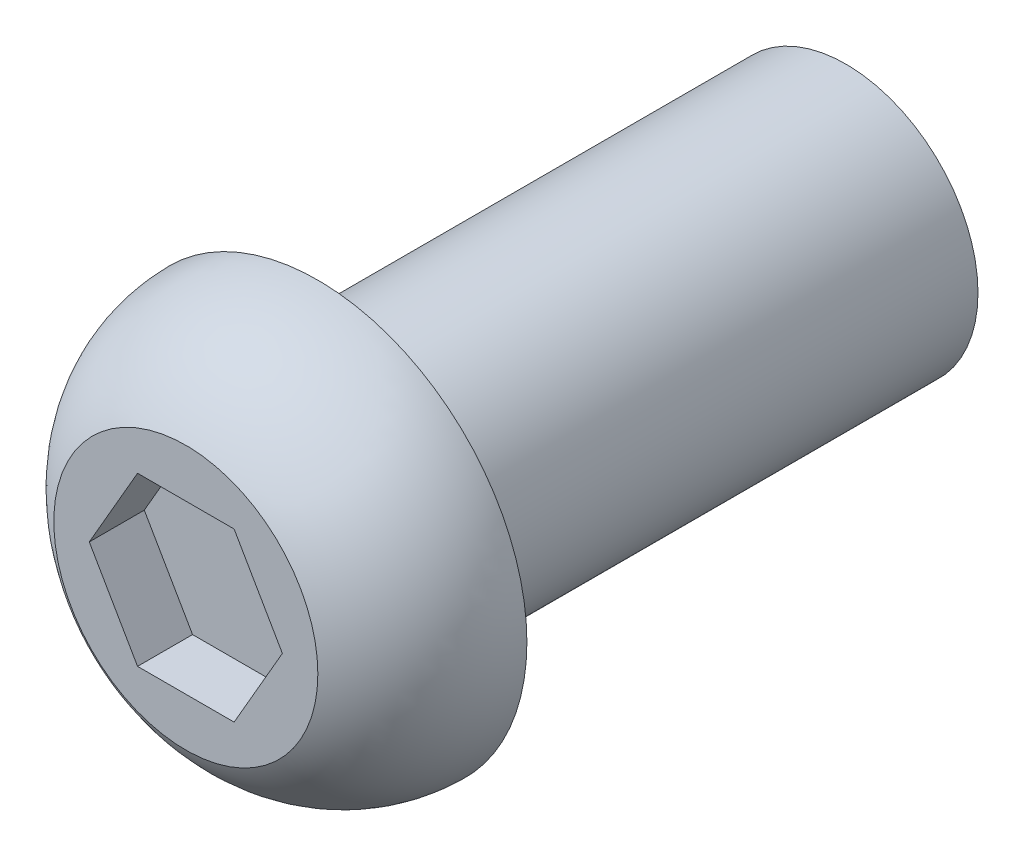
ISO-10303-21;
HEADER;
FILE_DESCRIPTION(('STEP AP214'),'2;1');
FILE_NAME('part.step','',(''),(''),'','','');
FILE_SCHEMA(('AUTOMOTIVE_DESIGN { 1 0 10303 214 1 1 1 1 }'));
ENDSEC;
DATA;
#1=APPLICATION_CONTEXT('core data for automotive mechanical design processes');
#2=APPLICATION_PROTOCOL_DEFINITION('international standard','automotive_design',2000,#1);
#3=PRODUCT_CONTEXT('',#1,'mechanical');
#4=PRODUCT('Part','Part','',(#3));
#5=PRODUCT_RELATED_PRODUCT_CATEGORY('part','',(#4));
#6=PRODUCT_DEFINITION_FORMATION('','',#4);
#7=PRODUCT_DEFINITION_CONTEXT('part definition',#1,'design');
#8=PRODUCT_DEFINITION('design','',#6,#7);
#9=PRODUCT_DEFINITION_SHAPE('','',#8);
#10=(LENGTH_UNIT() NAMED_UNIT(*) SI_UNIT(.MILLI.,.METRE.));
#11=(NAMED_UNIT(*) PLANE_ANGLE_UNIT() SI_UNIT($,.RADIAN.));
#12=(NAMED_UNIT(*) SI_UNIT($,.STERADIAN.) SOLID_ANGLE_UNIT());
#13=UNCERTAINTY_MEASURE_WITH_UNIT(LENGTH_MEASURE(1.E-05),#10,'distance_accuracy_value','');
#14=(GEOMETRIC_REPRESENTATION_CONTEXT(3) GLOBAL_UNCERTAINTY_ASSIGNED_CONTEXT((#13)) GLOBAL_UNIT_ASSIGNED_CONTEXT((#10,
#11,#12)) REPRESENTATION_CONTEXT('',''));
#15=CARTESIAN_POINT('',(0.,0.,0.));
#16=DIRECTION('',(0.,0.,1.));
#17=DIRECTION('',(1.,0.,0.));
#18=AXIS2_PLACEMENT_3D('',#15,#16,#17);
#19=CARTESIAN_POINT('',(0.,-6.,-6.));
#20=DIRECTION('',(0.,0.,1.));
#21=DIRECTION('',(1.,0.,0.));
#22=AXIS2_PLACEMENT_3D('',#19,#20,#21);
#23=PLANE('',#22);
#24=CARTESIAN_POINT('',(0.,0.,-6.));
#25=DIRECTION('',(0.,0.,1.));
#26=DIRECTION('',(1.,0.,0.));
#27=AXIS2_PLACEMENT_3D('',#24,#25,#26);
#28=CIRCLE('',#27,9.5);
#29=CARTESIAN_POINT('',(9.5,0.,-6.));
#30=VERTEX_POINT('',#29);
#31=EDGE_CURVE('E123',#30,#30,#28,.T.);
#32=ORIENTED_EDGE('',*,*,#31,.F.);
#33=EDGE_LOOP('',(#32));
#34=FACE_BOUND('',#33,.T.);
#35=CARTESIAN_POINT('',(0.,0.,-6.));
#36=DIRECTION('',(0.,0.,1.));
#37=DIRECTION('',(1.,0.,0.));
#38=AXIS2_PLACEMENT_3D('',#35,#36,#37);
#39=CIRCLE('',#38,6.);
#40=CARTESIAN_POINT('',(6.,0.,-6.));
#41=VERTEX_POINT('',#40);
#42=EDGE_CURVE('E41',#41,#41,#39,.T.);
#43=ORIENTED_EDGE('',*,*,#42,.T.);
#44=EDGE_LOOP('',(#43));
#45=FACE_BOUND('',#44,.T.);
#46=ADVANCED_FACE('F34',(#34,#45),#23,.F.);
#47=CARTESIAN_POINT('',(0.,0.,-30.));
#48=DIRECTION('',(0.,0.,1.));
#49=DIRECTION('',(1.,0.,0.));
#50=AXIS2_PLACEMENT_3D('',#47,#48,#49);
#51=PLANE('',#50);
#52=CARTESIAN_POINT('',(0.,0.,-30.));
#53=DIRECTION('',(0.,0.,1.));
#54=DIRECTION('',(1.,0.,0.));
#55=AXIS2_PLACEMENT_3D('',#52,#53,#54);
#56=CIRCLE('',#55,6.);
#57=CARTESIAN_POINT('',(6.,0.,-30.));
#58=VERTEX_POINT('',#57);
#59=EDGE_CURVE('E11',#58,#58,#56,.T.);
#60=ORIENTED_EDGE('',*,*,#59,.F.);
#61=EDGE_LOOP('',(#60));
#62=FACE_BOUND('',#61,.T.);
#63=ADVANCED_FACE('F148',(#62),#51,.F.);
#64=CARTESIAN_POINT('',(0.,0.,0.));
#65=DIRECTION('',(0.,0.,1.));
#66=DIRECTION('',(1.,0.,0.));
#67=AXIS2_PLACEMENT_3D('',#64,#65,#66);
#68=CYLINDRICAL_SURFACE('',#67,6.);
#69=ORIENTED_EDGE('',*,*,#42,.F.);
#70=EDGE_LOOP('',(#69));
#71=FACE_BOUND('',#70,.T.);
#72=ORIENTED_EDGE('',*,*,#59,.T.);
#73=EDGE_LOOP('',(#72));
#74=FACE_BOUND('',#73,.T.);
#75=ADVANCED_FACE('F144',(#71,#74),#68,.T.);
#76=CARTESIAN_POINT('',(0.,0.,-6.));
#77=DIRECTION('',(0.,0.,1.));
#78=DIRECTION('',(1.,0.,0.));
#79=AXIS2_PLACEMENT_3D('',#76,#77,#78);
#80=DEGENERATE_TOROIDAL_SURFACE('',#79,2.60714285714286,6.89285714285714,.T.);
#81=ORIENTED_EDGE('',*,*,#31,.T.);
#82=EDGE_LOOP('',(#81));
#83=FACE_BOUND('',#82,.T.);
#84=CARTESIAN_POINT('',(0.,0.,0.));
#85=DIRECTION('',(0.,0.,1.));
#86=DIRECTION('',(1.,0.,0.));
#87=AXIS2_PLACEMENT_3D('',#84,#85,#86);
#88=CIRCLE('',#87,6.);
#89=CARTESIAN_POINT('',(6.,0.,0.));
#90=VERTEX_POINT('',#89);
#91=EDGE_CURVE('E174',#90,#90,#88,.T.);
#92=ORIENTED_EDGE('',*,*,#91,.F.);
#93=EDGE_LOOP('',(#92));
#94=FACE_BOUND('',#93,.T.);
#95=ADVANCED_FACE('F147',(#83,#94),#80,.T.);
#96=CARTESIAN_POINT('',(2.19393102292058,-3.8,-2.5));
#97=DIRECTION('',(0.,0.,1.));
#98=DIRECTION('',(1.,0.,0.));
#99=AXIS2_PLACEMENT_3D('',#96,#97,#98);
#100=PLANE('',#99);
#101=DIRECTION('',(1.,0.,0.));
#102=VECTOR('',#101,1.);
#103=CARTESIAN_POINT('',(-2.19393102292058,-3.8,-2.5));
#104=LINE('',#103,#102);
#105=CARTESIAN_POINT('',(-2.19393102292058,-3.8,-2.5));
#106=VERTEX_POINT('',#105);
#107=CARTESIAN_POINT('',(2.19393102292058,-3.8,-2.5));
#108=VERTEX_POINT('',#107);
#109=EDGE_CURVE('E134',#106,#108,#104,.T.);
#110=ORIENTED_EDGE('',*,*,#109,.T.);
#111=DIRECTION('',(0.5,0.866025403784439,0.));
#112=VECTOR('',#111,1.);
#113=CARTESIAN_POINT('',(2.19393102292058,-3.8,-2.5));
#114=LINE('',#113,#112);
#115=CARTESIAN_POINT('',(4.38786204584116,0.,-2.5));
#116=VERTEX_POINT('',#115);
#117=EDGE_CURVE('E116',#108,#116,#114,.T.);
#118=ORIENTED_EDGE('',*,*,#117,.T.);
#119=DIRECTION('',(-0.5,0.866025403784439,0.));
#120=VECTOR('',#119,1.);
#121=CARTESIAN_POINT('',(4.38786204584116,0.,-2.5));
#122=LINE('',#121,#120);
#123=CARTESIAN_POINT('',(2.19393102292058,3.8,-2.5));
#124=VERTEX_POINT('',#123);
#125=EDGE_CURVE('E114',#116,#124,#122,.T.);
#126=ORIENTED_EDGE('',*,*,#125,.T.);
#127=DIRECTION('',(-1.,0.,0.));
#128=VECTOR('',#127,1.);
#129=CARTESIAN_POINT('',(2.19393102292058,3.8,-2.5));
#130=LINE('',#129,#128);
#131=CARTESIAN_POINT('',(-2.19393102292058,3.8,-2.5));
#132=VERTEX_POINT('',#131);
#133=EDGE_CURVE('E93',#124,#132,#130,.T.);
#134=ORIENTED_EDGE('',*,*,#133,.T.);
#135=DIRECTION('',(-0.5,-0.866025403784439,0.));
#136=VECTOR('',#135,1.);
#137=CARTESIAN_POINT('',(-2.19393102292058,3.8,-2.5));
#138=LINE('',#137,#136);
#139=CARTESIAN_POINT('',(-4.38786204584116,0.,-2.5));
#140=VERTEX_POINT('',#139);
#141=EDGE_CURVE('E104',#132,#140,#138,.T.);
#142=ORIENTED_EDGE('',*,*,#141,.T.);
#143=DIRECTION('',(0.5,-0.866025403784439,0.));
#144=VECTOR('',#143,1.);
#145=CARTESIAN_POINT('',(-4.38786204584116,0.,-2.5));
#146=LINE('',#145,#144);
#147=EDGE_CURVE('E108',#140,#106,#146,.T.);
#148=ORIENTED_EDGE('',*,*,#147,.T.);
#149=EDGE_LOOP('',(#110,#118,#126,#134,#142,#148));
#150=FACE_BOUND('',#149,.T.);
#151=ADVANCED_FACE('F111',(#150),#100,.T.);
#152=CARTESIAN_POINT('',(4.38786204584116,0.,-2.5));
#153=DIRECTION('',(0.866025403784439,0.5,0.));
#154=DIRECTION('',(-0.5,0.866025403784439,0.));
#155=AXIS2_PLACEMENT_3D('',#152,#153,#154);
#156=PLANE('',#155);
#157=DIRECTION('',(-0.5,0.866025403784439,0.));
#158=VECTOR('',#157,1.);
#159=CARTESIAN_POINT('',(4.38786204584116,0.,0.));
#160=LINE('',#159,#158);
#161=CARTESIAN_POINT('',(4.38786204584116,0.,0.));
#162=VERTEX_POINT('',#161);
#163=CARTESIAN_POINT('',(2.19393102292058,3.8,0.));
#164=VERTEX_POINT('',#163);
#165=EDGE_CURVE('E126',#162,#164,#160,.T.);
#166=ORIENTED_EDGE('',*,*,#165,.T.);
#167=DIRECTION('',(0.,0.,1.));
#168=VECTOR('',#167,1.);
#169=CARTESIAN_POINT('',(2.19393102292058,3.8,-2.5));
#170=LINE('',#169,#168);
#171=EDGE_CURVE('E101',#124,#164,#170,.T.);
#172=ORIENTED_EDGE('',*,*,#171,.F.);
#173=ORIENTED_EDGE('',*,*,#125,.F.);
#174=DIRECTION('',(0.,0.,1.));
#175=VECTOR('',#174,1.);
#176=CARTESIAN_POINT('',(4.38786204584116,0.,-2.5));
#177=LINE('',#176,#175);
#178=EDGE_CURVE('E138',#116,#162,#177,.T.);
#179=ORIENTED_EDGE('',*,*,#178,.T.);
#180=EDGE_LOOP('',(#166,#172,#173,#179));
#181=FACE_BOUND('',#180,.T.);
#182=ADVANCED_FACE('F181',(#181),#156,.F.);
#183=CARTESIAN_POINT('',(2.19393102292058,3.8,-2.5));
#184=DIRECTION('',(0.,1.,0.));
#185=DIRECTION('',(0.,0.,1.));
#186=AXIS2_PLACEMENT_3D('',#183,#184,#185);
#187=PLANE('',#186);
#188=DIRECTION('',(-1.,0.,0.));
#189=VECTOR('',#188,1.);
#190=CARTESIAN_POINT('',(2.19393102292058,3.8,0.));
#191=LINE('',#190,#189);
#192=CARTESIAN_POINT('',(-2.19393102292058,3.8,0.));
#193=VERTEX_POINT('',#192);
#194=EDGE_CURVE('E96',#164,#193,#191,.T.);
#195=ORIENTED_EDGE('',*,*,#194,.T.);
#196=DIRECTION('',(0.,0.,1.));
#197=VECTOR('',#196,1.);
#198=CARTESIAN_POINT('',(-2.19393102292058,3.8,-2.5));
#199=LINE('',#198,#197);
#200=EDGE_CURVE('E89',#132,#193,#199,.T.);
#201=ORIENTED_EDGE('',*,*,#200,.F.);
#202=ORIENTED_EDGE('',*,*,#133,.F.);
#203=ORIENTED_EDGE('',*,*,#171,.T.);
#204=EDGE_LOOP('',(#195,#201,#202,#203));
#205=FACE_BOUND('',#204,.T.);
#206=ADVANCED_FACE('F91',(#205),#187,.F.);
#207=CARTESIAN_POINT('',(-2.19393102292058,3.8,-2.5));
#208=DIRECTION('',(-0.866025403784439,0.5,0.));
#209=DIRECTION('',(-0.5,-0.866025403784439,0.));
#210=AXIS2_PLACEMENT_3D('',#207,#208,#209);
#211=PLANE('',#210);
#212=DIRECTION('',(-0.5,-0.866025403784439,0.));
#213=VECTOR('',#212,1.);
#214=CARTESIAN_POINT('',(-2.19393102292058,3.8,0.));
#215=LINE('',#214,#213);
#216=CARTESIAN_POINT('',(-4.38786204584116,0.,0.));
#217=VERTEX_POINT('',#216);
#218=EDGE_CURVE('E130',#193,#217,#215,.T.);
#219=ORIENTED_EDGE('',*,*,#218,.T.);
#220=DIRECTION('',(0.,0.,1.));
#221=VECTOR('',#220,1.);
#222=CARTESIAN_POINT('',(-4.38786204584116,0.,-2.5));
#223=LINE('',#222,#221);
#224=EDGE_CURVE('E100',#140,#217,#223,.T.);
#225=ORIENTED_EDGE('',*,*,#224,.F.);
#226=ORIENTED_EDGE('',*,*,#141,.F.);
#227=ORIENTED_EDGE('',*,*,#200,.T.);
#228=EDGE_LOOP('',(#219,#225,#226,#227));
#229=FACE_BOUND('',#228,.T.);
#230=ADVANCED_FACE('F105',(#229),#211,.F.);
#231=CARTESIAN_POINT('',(-4.38786204584116,0.,-2.5));
#232=DIRECTION('',(-0.866025403784439,-0.5,0.));
#233=DIRECTION('',(0.5,-0.866025403784439,0.));
#234=AXIS2_PLACEMENT_3D('',#231,#232,#233);
#235=PLANE('',#234);
#236=DIRECTION('',(0.5,-0.866025403784439,0.));
#237=VECTOR('',#236,1.);
#238=CARTESIAN_POINT('',(-4.38786204584116,0.,0.));
#239=LINE('',#238,#237);
#240=CARTESIAN_POINT('',(-2.19393102292058,-3.8,0.));
#241=VERTEX_POINT('',#240);
#242=EDGE_CURVE('E132',#217,#241,#239,.T.);
#243=ORIENTED_EDGE('',*,*,#242,.T.);
#244=DIRECTION('',(0.,0.,1.));
#245=VECTOR('',#244,1.);
#246=CARTESIAN_POINT('',(-2.19393102292058,-3.8,-2.5));
#247=LINE('',#246,#245);
#248=EDGE_CURVE('E56',#106,#241,#247,.T.);
#249=ORIENTED_EDGE('',*,*,#248,.F.);
#250=ORIENTED_EDGE('',*,*,#147,.F.);
#251=ORIENTED_EDGE('',*,*,#224,.T.);
#252=EDGE_LOOP('',(#243,#249,#250,#251));
#253=FACE_BOUND('',#252,.T.);
#254=ADVANCED_FACE('F183',(#253),#235,.F.);
#255=CARTESIAN_POINT('',(-2.19393102292058,-3.8,-2.5));
#256=DIRECTION('',(0.,-1.,0.));
#257=DIRECTION('',(1.,0.,0.));
#258=AXIS2_PLACEMENT_3D('',#255,#256,#257);
#259=PLANE('',#258);
#260=DIRECTION('',(1.,0.,0.));
#261=VECTOR('',#260,1.);
#262=CARTESIAN_POINT('',(-2.19393102292058,-3.8,0.));
#263=LINE('',#262,#261);
#264=CARTESIAN_POINT('',(2.19393102292058,-3.8,0.));
#265=VERTEX_POINT('',#264);
#266=EDGE_CURVE('E48',#241,#265,#263,.T.);
#267=ORIENTED_EDGE('',*,*,#266,.T.);
#268=DIRECTION('',(0.,0.,1.));
#269=VECTOR('',#268,1.);
#270=CARTESIAN_POINT('',(2.19393102292058,-3.8,-2.5));
#271=LINE('',#270,#269);
#272=EDGE_CURVE('E78',#108,#265,#271,.T.);
#273=ORIENTED_EDGE('',*,*,#272,.F.);
#274=ORIENTED_EDGE('',*,*,#109,.F.);
#275=ORIENTED_EDGE('',*,*,#248,.T.);
#276=EDGE_LOOP('',(#267,#273,#274,#275));
#277=FACE_BOUND('',#276,.T.);
#278=ADVANCED_FACE('F166',(#277),#259,.F.);
#279=CARTESIAN_POINT('',(2.19393102292058,-3.8,-2.5));
#280=DIRECTION('',(0.866025403784439,-0.5,0.));
#281=DIRECTION('',(0.5,0.866025403784439,0.));
#282=AXIS2_PLACEMENT_3D('',#279,#280,#281);
#283=PLANE('',#282);
#284=DIRECTION('',(0.5,0.866025403784439,0.));
#285=VECTOR('',#284,1.);
#286=CARTESIAN_POINT('',(2.19393102292058,-3.8,0.));
#287=LINE('',#286,#285);
#288=EDGE_CURVE('E122',#265,#162,#287,.T.);
#289=ORIENTED_EDGE('',*,*,#288,.T.);
#290=ORIENTED_EDGE('',*,*,#178,.F.);
#291=ORIENTED_EDGE('',*,*,#117,.F.);
#292=ORIENTED_EDGE('',*,*,#272,.T.);
#293=EDGE_LOOP('',(#289,#290,#291,#292));
#294=FACE_BOUND('',#293,.T.);
#295=ADVANCED_FACE('F161',(#294),#283,.F.);
#296=CARTESIAN_POINT('',(0.,-9.5,0.));
#297=DIRECTION('',(0.,0.,-1.));
#298=DIRECTION('',(-1.,0.,0.));
#299=AXIS2_PLACEMENT_3D('',#296,#297,#298);
#300=PLANE('',#299);
#301=ORIENTED_EDGE('',*,*,#288,.F.);
#302=ORIENTED_EDGE('',*,*,#266,.F.);
#303=ORIENTED_EDGE('',*,*,#242,.F.);
#304=ORIENTED_EDGE('',*,*,#218,.F.);
#305=ORIENTED_EDGE('',*,*,#194,.F.);
#306=ORIENTED_EDGE('',*,*,#165,.F.);
#307=EDGE_LOOP('',(#301,#302,#303,#304,#305,#306));
#308=FACE_BOUND('',#307,.T.);
#309=ORIENTED_EDGE('',*,*,#91,.T.);
#310=EDGE_LOOP('',(#309));
#311=FACE_BOUND('',#310,.T.);
#312=ADVANCED_FACE('F159',(#308,#311),#300,.F.);
#313=CLOSED_SHELL('',(#46,#63,#75,#95,#151,#182,#206,#230,#254,#278,#295,#312));
#314=MANIFOLD_SOLID_BREP('B2',#313);
#315=ADVANCED_BREP_SHAPE_REPRESENTATION('',(#18,#314),#14);
#316=SHAPE_DEFINITION_REPRESENTATION(#9,#315);
ENDSEC;
END-ISO-10303-21;
